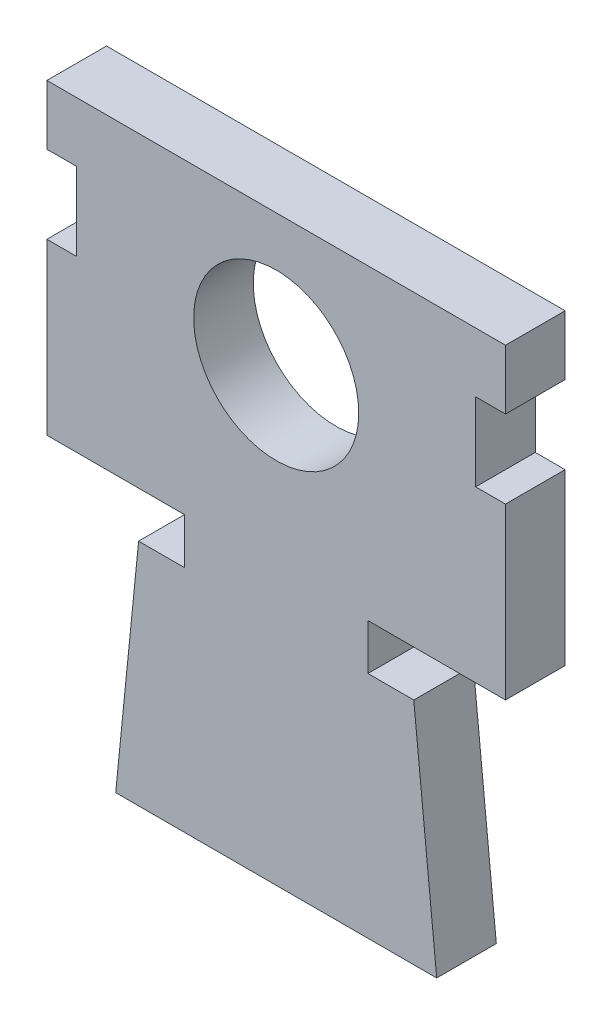
ISO-10303-21;
HEADER;
FILE_DESCRIPTION(('STEP AP214'),'2;1');
FILE_NAME('part.step','',(''),(''),'','','');
FILE_SCHEMA(('AUTOMOTIVE_DESIGN { 1 0 10303 214 1 1 1 1 }'));
ENDSEC;
DATA;
#1=APPLICATION_CONTEXT('core data for automotive mechanical design processes');
#2=APPLICATION_PROTOCOL_DEFINITION('international standard','automotive_design',2000,#1);
#3=PRODUCT_CONTEXT('',#1,'mechanical');
#4=PRODUCT('Part','Part','',(#3));
#5=PRODUCT_RELATED_PRODUCT_CATEGORY('part','',(#4));
#6=PRODUCT_DEFINITION_FORMATION('','',#4);
#7=PRODUCT_DEFINITION_CONTEXT('part definition',#1,'design');
#8=PRODUCT_DEFINITION('design','',#6,#7);
#9=PRODUCT_DEFINITION_SHAPE('','',#8);
#10=(LENGTH_UNIT() NAMED_UNIT(*) SI_UNIT(.MILLI.,.METRE.));
#11=(NAMED_UNIT(*) PLANE_ANGLE_UNIT() SI_UNIT($,.RADIAN.));
#12=(NAMED_UNIT(*) SI_UNIT($,.STERADIAN.) SOLID_ANGLE_UNIT());
#13=UNCERTAINTY_MEASURE_WITH_UNIT(LENGTH_MEASURE(1.E-05),#10,'distance_accuracy_value','');
#14=(GEOMETRIC_REPRESENTATION_CONTEXT(3) GLOBAL_UNCERTAINTY_ASSIGNED_CONTEXT((#13)) GLOBAL_UNIT_ASSIGNED_CONTEXT((#10,
#11,#12)) REPRESENTATION_CONTEXT('',''));
#15=CARTESIAN_POINT('',(0.,0.,0.));
#16=DIRECTION('',(0.,0.,1.));
#17=DIRECTION('',(1.,0.,0.));
#18=AXIS2_PLACEMENT_3D('',#15,#16,#17);
#19=CARTESIAN_POINT('',(0.,0.,1.3));
#20=DIRECTION('',(0.,0.,-1.));
#21=DIRECTION('',(-1.,0.,0.));
#22=AXIS2_PLACEMENT_3D('',#19,#20,#21);
#23=PLANE('',#22);
#24=DIRECTION('',(0.,-1.,0.));
#25=VECTOR('',#24,1.);
#26=CARTESIAN_POINT('',(-8.56550234988967,64.6174128611392,1.3));
#27=LINE('',#26,#25);
#28=CARTESIAN_POINT('',(-8.56550234988967,65.9174128611392,1.3));
#29=VERTEX_POINT('',#28);
#30=CARTESIAN_POINT('',(-8.56550234988967,64.6174128611392,1.3));
#31=VERTEX_POINT('',#30);
#32=EDGE_CURVE('E240',#29,#31,#27,.T.);
#33=ORIENTED_EDGE('',*,*,#32,.T.);
#34=DIRECTION('',(1.,0.,0.));
#35=VECTOR('',#34,1.);
#36=CARTESIAN_POINT('',(-7.91550234988968,64.6174128611392,1.3));
#37=LINE('',#36,#35);
#38=CARTESIAN_POINT('',(-7.91550234988968,64.6174128611392,1.3));
#39=VERTEX_POINT('',#38);
#40=EDGE_CURVE('E128',#31,#39,#37,.T.);
#41=ORIENTED_EDGE('',*,*,#40,.T.);
#42=DIRECTION('',(0.,-1.,0.));
#43=VECTOR('',#42,1.);
#44=CARTESIAN_POINT('',(-7.91550234988968,62.9174128611392,1.3));
#45=LINE('',#44,#43);
#46=CARTESIAN_POINT('',(-7.91550234988968,62.9174128611392,1.3));
#47=VERTEX_POINT('',#46);
#48=EDGE_CURVE('E291',#39,#47,#45,.T.);
#49=ORIENTED_EDGE('',*,*,#48,.T.);
#50=DIRECTION('',(-1.,0.,0.));
#51=VECTOR('',#50,1.);
#52=CARTESIAN_POINT('',(-8.56550234988967,62.9174128611392,1.3));
#53=LINE('',#52,#51);
#54=CARTESIAN_POINT('',(-8.56550234988967,62.9174128611392,1.3));
#55=VERTEX_POINT('',#54);
#56=EDGE_CURVE('E310',#47,#55,#53,.T.);
#57=ORIENTED_EDGE('',*,*,#56,.T.);
#58=DIRECTION('',(0.,-1.,0.));
#59=VECTOR('',#58,1.);
#60=CARTESIAN_POINT('',(-8.56550234988967,59.2174128611392,1.3));
#61=LINE('',#60,#59);
#62=CARTESIAN_POINT('',(-8.56550234988967,59.2174128611392,1.3));
#63=VERTEX_POINT('',#62);
#64=EDGE_CURVE('E307',#55,#63,#61,.T.);
#65=ORIENTED_EDGE('',*,*,#64,.T.);
#66=DIRECTION('',(1.,0.,0.));
#67=VECTOR('',#66,1.);
#68=CARTESIAN_POINT('',(-5.56550234988967,59.2174128611392,1.3));
#69=LINE('',#68,#67);
#70=CARTESIAN_POINT('',(-5.56550234988967,59.2174128611392,1.3));
#71=VERTEX_POINT('',#70);
#72=EDGE_CURVE('E309',#63,#71,#69,.T.);
#73=ORIENTED_EDGE('',*,*,#72,.T.);
#74=DIRECTION('',(0.,-1.,0.));
#75=VECTOR('',#74,1.);
#76=CARTESIAN_POINT('',(-5.56550234988967,58.2174128611392,1.3));
#77=LINE('',#76,#75);
#78=CARTESIAN_POINT('',(-5.56550234988967,58.2174128611392,1.3));
#79=VERTEX_POINT('',#78);
#80=EDGE_CURVE('E312',#71,#79,#77,.T.);
#81=ORIENTED_EDGE('',*,*,#80,.T.);
#82=DIRECTION('',(-1.,0.,0.));
#83=VECTOR('',#82,1.);
#84=CARTESIAN_POINT('',(-6.56550234988967,58.2174128611392,1.3));
#85=LINE('',#84,#83);
#86=CARTESIAN_POINT('',(-6.56550234988967,58.2174128611392,1.3));
#87=VERTEX_POINT('',#86);
#88=EDGE_CURVE('E318',#79,#87,#85,.T.);
#89=ORIENTED_EDGE('',*,*,#88,.T.);
#90=DIRECTION('',(-0.0995037190209989,-0.995037190209989,0.));
#91=VECTOR('',#90,1.);
#92=CARTESIAN_POINT('',(-7.06550234988967,53.2174128611392,1.3));
#93=LINE('',#92,#91);
#94=CARTESIAN_POINT('',(-7.06550234988967,53.2174128611392,1.3));
#95=VERTEX_POINT('',#94);
#96=EDGE_CURVE('E320',#87,#95,#93,.T.);
#97=ORIENTED_EDGE('',*,*,#96,.T.);
#98=DIRECTION('',(1.,0.,0.));
#99=VECTOR('',#98,1.);
#100=CARTESIAN_POINT('',(-0.0655023498896731,53.2174128611392,1.3));
#101=LINE('',#100,#99);
#102=CARTESIAN_POINT('',(-0.0655023498896731,53.2174128611392,1.3));
#103=VERTEX_POINT('',#102);
#104=EDGE_CURVE('E322',#95,#103,#101,.T.);
#105=ORIENTED_EDGE('',*,*,#104,.T.);
#106=DIRECTION('',(-0.0995037190209991,0.995037190209989,0.));
#107=VECTOR('',#106,1.);
#108=CARTESIAN_POINT('',(-0.565502349889674,58.2174128611392,1.3));
#109=LINE('',#108,#107);
#110=CARTESIAN_POINT('',(-0.565502349889674,58.2174128611392,1.3));
#111=VERTEX_POINT('',#110);
#112=EDGE_CURVE('E324',#103,#111,#109,.T.);
#113=ORIENTED_EDGE('',*,*,#112,.T.);
#114=DIRECTION('',(-1.,0.,0.));
#115=VECTOR('',#114,1.);
#116=CARTESIAN_POINT('',(-1.56550234988967,58.2174128611392,1.3));
#117=LINE('',#116,#115);
#118=CARTESIAN_POINT('',(-1.56550234988967,58.2174128611392,1.3));
#119=VERTEX_POINT('',#118);
#120=EDGE_CURVE('E326',#111,#119,#117,.T.);
#121=ORIENTED_EDGE('',*,*,#120,.T.);
#122=DIRECTION('',(0.,1.,0.));
#123=VECTOR('',#122,1.);
#124=CARTESIAN_POINT('',(-1.56550234988967,59.2174128611392,1.3));
#125=LINE('',#124,#123);
#126=CARTESIAN_POINT('',(-1.56550234988967,59.2174128611392,1.3));
#127=VERTEX_POINT('',#126);
#128=EDGE_CURVE('E328',#119,#127,#125,.T.);
#129=ORIENTED_EDGE('',*,*,#128,.T.);
#130=DIRECTION('',(1.,0.,0.));
#131=VECTOR('',#130,1.);
#132=CARTESIAN_POINT('',(1.43449765011033,59.2174128611392,1.3));
#133=LINE('',#132,#131);
#134=CARTESIAN_POINT('',(1.43449765011033,59.2174128611392,1.3));
#135=VERTEX_POINT('',#134);
#136=EDGE_CURVE('E330',#127,#135,#133,.T.);
#137=ORIENTED_EDGE('',*,*,#136,.T.);
#138=DIRECTION('',(0.,1.,0.));
#139=VECTOR('',#138,1.);
#140=CARTESIAN_POINT('',(1.43449765011033,62.9174128611392,1.3));
#141=LINE('',#140,#139);
#142=CARTESIAN_POINT('',(1.43449765011033,62.9174128611392,1.3));
#143=VERTEX_POINT('',#142);
#144=EDGE_CURVE('E332',#135,#143,#141,.T.);
#145=ORIENTED_EDGE('',*,*,#144,.T.);
#146=DIRECTION('',(-1.,0.,0.));
#147=VECTOR('',#146,1.);
#148=CARTESIAN_POINT('',(0.784497650110324,62.9174128611392,1.3));
#149=LINE('',#148,#147);
#150=CARTESIAN_POINT('',(0.784497650110324,62.9174128611392,1.3));
#151=VERTEX_POINT('',#150);
#152=EDGE_CURVE('E334',#143,#151,#149,.T.);
#153=ORIENTED_EDGE('',*,*,#152,.T.);
#154=DIRECTION('',(0.,1.,0.));
#155=VECTOR('',#154,1.);
#156=CARTESIAN_POINT('',(0.784497650110324,64.6174128611392,1.3));
#157=LINE('',#156,#155);
#158=CARTESIAN_POINT('',(0.784497650110324,64.6174128611392,1.3));
#159=VERTEX_POINT('',#158);
#160=EDGE_CURVE('E183',#151,#159,#157,.T.);
#161=ORIENTED_EDGE('',*,*,#160,.T.);
#162=DIRECTION('',(1.,0.,0.));
#163=VECTOR('',#162,1.);
#164=CARTESIAN_POINT('',(1.43449765011033,64.6174128611392,1.3));
#165=LINE('',#164,#163);
#166=CARTESIAN_POINT('',(1.43449765011033,64.6174128611392,1.3));
#167=VERTEX_POINT('',#166);
#168=EDGE_CURVE('E177',#159,#167,#165,.T.);
#169=ORIENTED_EDGE('',*,*,#168,.T.);
#170=DIRECTION('',(0.,1.,0.));
#171=VECTOR('',#170,1.);
#172=CARTESIAN_POINT('',(1.43449765011032,65.9174128611392,1.3));
#173=LINE('',#172,#171);
#174=CARTESIAN_POINT('',(1.43449765011032,65.9174128611392,1.3));
#175=VERTEX_POINT('',#174);
#176=EDGE_CURVE('E181',#167,#175,#173,.T.);
#177=ORIENTED_EDGE('',*,*,#176,.T.);
#178=DIRECTION('',(-1.,0.,0.));
#179=VECTOR('',#178,1.);
#180=CARTESIAN_POINT('',(-8.56550234988967,65.9174128611392,1.3));
#181=LINE('',#180,#179);
#182=EDGE_CURVE('E49',#175,#29,#181,.T.);
#183=ORIENTED_EDGE('',*,*,#182,.T.);
#184=EDGE_LOOP('',(#33,#41,#49,#57,#65,#73,#81,#89,#97,#105,#113,#121,#129,#137,#145,#153,#161,
#169,#177,#183));
#185=FACE_BOUND('',#184,.T.);
#186=CARTESIAN_POINT('',(-3.56550234988968,63.0374128611392,1.3));
#187=DIRECTION('',(0.,0.,1.));
#188=DIRECTION('',(1.,0.,0.));
#189=AXIS2_PLACEMENT_3D('',#186,#187,#188);
#190=CIRCLE('',#189,1.8);
#191=CARTESIAN_POINT('',(-1.76550234988968,63.0374128611392,1.3));
#192=VERTEX_POINT('',#191);
#193=EDGE_CURVE('E205',#192,#192,#190,.T.);
#194=ORIENTED_EDGE('',*,*,#193,.F.);
#195=EDGE_LOOP('',(#194));
#196=FACE_BOUND('',#195,.T.);
#197=ADVANCED_FACE('F32',(#185,#196),#23,.F.);
#198=CARTESIAN_POINT('',(0.,0.,0.));
#199=DIRECTION('',(0.,0.,-1.));
#200=DIRECTION('',(-1.,0.,0.));
#201=AXIS2_PLACEMENT_3D('',#198,#199,#200);
#202=PLANE('',#201);
#203=DIRECTION('',(0.,-1.,0.));
#204=VECTOR('',#203,1.);
#205=CARTESIAN_POINT('',(-8.56550234988967,64.6174128611392,0.));
#206=LINE('',#205,#204);
#207=CARTESIAN_POINT('',(-8.56550234988967,65.9174128611392,0.));
#208=VERTEX_POINT('',#207);
#209=CARTESIAN_POINT('',(-8.56550234988967,64.6174128611392,0.));
#210=VERTEX_POINT('',#209);
#211=EDGE_CURVE('E201',#208,#210,#206,.T.);
#212=ORIENTED_EDGE('',*,*,#211,.F.);
#213=DIRECTION('',(-1.,0.,0.));
#214=VECTOR('',#213,1.);
#215=CARTESIAN_POINT('',(-8.56550234988967,65.9174128611392,0.));
#216=LINE('',#215,#214);
#217=CARTESIAN_POINT('',(1.43449765011032,65.9174128611392,0.));
#218=VERTEX_POINT('',#217);
#219=EDGE_CURVE('E120',#218,#208,#216,.T.);
#220=ORIENTED_EDGE('',*,*,#219,.F.);
#221=DIRECTION('',(0.,1.,0.));
#222=VECTOR('',#221,1.);
#223=CARTESIAN_POINT('',(1.43449765011032,65.9174128611392,0.));
#224=LINE('',#223,#222);
#225=CARTESIAN_POINT('',(1.43449765011033,64.6174128611392,0.));
#226=VERTEX_POINT('',#225);
#227=EDGE_CURVE('E114',#226,#218,#224,.T.);
#228=ORIENTED_EDGE('',*,*,#227,.F.);
#229=DIRECTION('',(1.,0.,0.));
#230=VECTOR('',#229,1.);
#231=CARTESIAN_POINT('',(1.43449765011033,64.6174128611392,0.));
#232=LINE('',#231,#230);
#233=CARTESIAN_POINT('',(0.784497650110324,64.6174128611392,0.));
#234=VERTEX_POINT('',#233);
#235=EDGE_CURVE('E191',#234,#226,#232,.T.);
#236=ORIENTED_EDGE('',*,*,#235,.F.);
#237=DIRECTION('',(0.,1.,0.));
#238=VECTOR('',#237,1.);
#239=CARTESIAN_POINT('',(0.784497650110324,64.6174128611392,0.));
#240=LINE('',#239,#238);
#241=CARTESIAN_POINT('',(0.784497650110324,62.9174128611392,0.));
#242=VERTEX_POINT('',#241);
#243=EDGE_CURVE('E235',#242,#234,#240,.T.);
#244=ORIENTED_EDGE('',*,*,#243,.F.);
#245=DIRECTION('',(-1.,0.,0.));
#246=VECTOR('',#245,1.);
#247=CARTESIAN_POINT('',(0.784497650110324,62.9174128611392,0.));
#248=LINE('',#247,#246);
#249=CARTESIAN_POINT('',(1.43449765011033,62.9174128611392,0.));
#250=VERTEX_POINT('',#249);
#251=EDGE_CURVE('E233',#250,#242,#248,.T.);
#252=ORIENTED_EDGE('',*,*,#251,.F.);
#253=DIRECTION('',(0.,1.,0.));
#254=VECTOR('',#253,1.);
#255=CARTESIAN_POINT('',(1.43449765011033,62.9174128611392,0.));
#256=LINE('',#255,#254);
#257=CARTESIAN_POINT('',(1.43449765011033,59.2174128611392,0.));
#258=VERTEX_POINT('',#257);
#259=EDGE_CURVE('E231',#258,#250,#256,.T.);
#260=ORIENTED_EDGE('',*,*,#259,.F.);
#261=DIRECTION('',(1.,0.,0.));
#262=VECTOR('',#261,1.);
#263=CARTESIAN_POINT('',(1.43449765011033,59.2174128611392,0.));
#264=LINE('',#263,#262);
#265=CARTESIAN_POINT('',(-1.56550234988967,59.2174128611392,0.));
#266=VERTEX_POINT('',#265);
#267=EDGE_CURVE('E229',#266,#258,#264,.T.);
#268=ORIENTED_EDGE('',*,*,#267,.F.);
#269=DIRECTION('',(0.,1.,0.));
#270=VECTOR('',#269,1.);
#271=CARTESIAN_POINT('',(-1.56550234988967,59.2174128611392,0.));
#272=LINE('',#271,#270);
#273=CARTESIAN_POINT('',(-1.56550234988967,58.2174128611392,0.));
#274=VERTEX_POINT('',#273);
#275=EDGE_CURVE('E227',#274,#266,#272,.T.);
#276=ORIENTED_EDGE('',*,*,#275,.F.);
#277=DIRECTION('',(-1.,0.,0.));
#278=VECTOR('',#277,1.);
#279=CARTESIAN_POINT('',(-1.56550234988967,58.2174128611392,0.));
#280=LINE('',#279,#278);
#281=CARTESIAN_POINT('',(-0.565502349889674,58.2174128611392,0.));
#282=VERTEX_POINT('',#281);
#283=EDGE_CURVE('E225',#282,#274,#280,.T.);
#284=ORIENTED_EDGE('',*,*,#283,.F.);
#285=DIRECTION('',(-0.0995037190209991,0.995037190209989,0.));
#286=VECTOR('',#285,1.);
#287=CARTESIAN_POINT('',(-0.565502349889674,58.2174128611392,0.));
#288=LINE('',#287,#286);
#289=CARTESIAN_POINT('',(-0.0655023498896731,53.2174128611392,0.));
#290=VERTEX_POINT('',#289);
#291=EDGE_CURVE('E223',#290,#282,#288,.T.);
#292=ORIENTED_EDGE('',*,*,#291,.F.);
#293=DIRECTION('',(1.,0.,0.));
#294=VECTOR('',#293,1.);
#295=CARTESIAN_POINT('',(-0.0655023498896731,53.2174128611392,0.));
#296=LINE('',#295,#294);
#297=CARTESIAN_POINT('',(-7.06550234988967,53.2174128611392,0.));
#298=VERTEX_POINT('',#297);
#299=EDGE_CURVE('E221',#298,#290,#296,.T.);
#300=ORIENTED_EDGE('',*,*,#299,.F.);
#301=DIRECTION('',(-0.0995037190209989,-0.995037190209989,0.));
#302=VECTOR('',#301,1.);
#303=CARTESIAN_POINT('',(-7.06550234988967,53.2174128611392,0.));
#304=LINE('',#303,#302);
#305=CARTESIAN_POINT('',(-6.56550234988967,58.2174128611392,0.));
#306=VERTEX_POINT('',#305);
#307=EDGE_CURVE('E219',#306,#298,#304,.T.);
#308=ORIENTED_EDGE('',*,*,#307,.F.);
#309=DIRECTION('',(-1.,0.,0.));
#310=VECTOR('',#309,1.);
#311=CARTESIAN_POINT('',(-6.56550234988967,58.2174128611392,0.));
#312=LINE('',#311,#310);
#313=CARTESIAN_POINT('',(-5.56550234988967,58.2174128611392,0.));
#314=VERTEX_POINT('',#313);
#315=EDGE_CURVE('E217',#314,#306,#312,.T.);
#316=ORIENTED_EDGE('',*,*,#315,.F.);
#317=DIRECTION('',(0.,-1.,0.));
#318=VECTOR('',#317,1.);
#319=CARTESIAN_POINT('',(-5.56550234988967,58.2174128611392,0.));
#320=LINE('',#319,#318);
#321=CARTESIAN_POINT('',(-5.56550234988967,59.2174128611392,0.));
#322=VERTEX_POINT('',#321);
#323=EDGE_CURVE('E215',#322,#314,#320,.T.);
#324=ORIENTED_EDGE('',*,*,#323,.F.);
#325=DIRECTION('',(1.,0.,0.));
#326=VECTOR('',#325,1.);
#327=CARTESIAN_POINT('',(-5.56550234988967,59.2174128611392,0.));
#328=LINE('',#327,#326);
#329=CARTESIAN_POINT('',(-8.56550234988967,59.2174128611392,0.));
#330=VERTEX_POINT('',#329);
#331=EDGE_CURVE('E213',#330,#322,#328,.T.);
#332=ORIENTED_EDGE('',*,*,#331,.F.);
#333=DIRECTION('',(0.,-1.,0.));
#334=VECTOR('',#333,1.);
#335=CARTESIAN_POINT('',(-8.56550234988967,59.2174128611392,0.));
#336=LINE('',#335,#334);
#337=CARTESIAN_POINT('',(-8.56550234988967,62.9174128611392,0.));
#338=VERTEX_POINT('',#337);
#339=EDGE_CURVE('E211',#338,#330,#336,.T.);
#340=ORIENTED_EDGE('',*,*,#339,.F.);
#341=DIRECTION('',(-1.,0.,0.));
#342=VECTOR('',#341,1.);
#343=CARTESIAN_POINT('',(-8.56550234988967,62.9174128611392,0.));
#344=LINE('',#343,#342);
#345=CARTESIAN_POINT('',(-7.91550234988968,62.9174128611392,0.));
#346=VERTEX_POINT('',#345);
#347=EDGE_CURVE('E209',#346,#338,#344,.T.);
#348=ORIENTED_EDGE('',*,*,#347,.F.);
#349=DIRECTION('',(0.,-1.,0.));
#350=VECTOR('',#349,1.);
#351=CARTESIAN_POINT('',(-7.91550234988968,62.9174128611392,0.));
#352=LINE('',#351,#350);
#353=CARTESIAN_POINT('',(-7.91550234988968,64.6174128611392,0.));
#354=VERTEX_POINT('',#353);
#355=EDGE_CURVE('E207',#354,#346,#352,.T.);
#356=ORIENTED_EDGE('',*,*,#355,.F.);
#357=DIRECTION('',(1.,0.,0.));
#358=VECTOR('',#357,1.);
#359=CARTESIAN_POINT('',(-7.91550234988968,64.6174128611392,0.));
#360=LINE('',#359,#358);
#361=EDGE_CURVE('E204',#210,#354,#360,.T.);
#362=ORIENTED_EDGE('',*,*,#361,.F.);
#363=EDGE_LOOP('',(#212,#220,#228,#236,#244,#252,#260,#268,#276,#284,#292,#300,#308,#316,#324,
#332,#340,#348,#356,#362));
#364=FACE_BOUND('',#363,.T.);
#365=CARTESIAN_POINT('',(-3.56550234988968,63.0374128611392,0.));
#366=DIRECTION('',(0.,0.,1.));
#367=DIRECTION('',(1.,0.,0.));
#368=AXIS2_PLACEMENT_3D('',#365,#366,#367);
#369=CIRCLE('',#368,1.8);
#370=CARTESIAN_POINT('',(-1.76550234988968,63.0374128611392,0.));
#371=VERTEX_POINT('',#370);
#372=EDGE_CURVE('E585',#371,#371,#369,.T.);
#373=ORIENTED_EDGE('',*,*,#372,.T.);
#374=EDGE_LOOP('',(#373));
#375=FACE_BOUND('',#374,.T.);
#376=ADVANCED_FACE('F295',(#364,#375),#202,.T.);
#377=CARTESIAN_POINT('',(-8.56550234988967,64.6174128611392,1.3));
#378=DIRECTION('',(1.,0.,0.));
#379=DIRECTION('',(0.,0.,-1.));
#380=AXIS2_PLACEMENT_3D('',#377,#378,#379);
#381=PLANE('',#380);
#382=ORIENTED_EDGE('',*,*,#211,.T.);
#383=DIRECTION('',(0.,0.,-1.));
#384=VECTOR('',#383,1.);
#385=CARTESIAN_POINT('',(-8.56550234988967,64.6174128611392,1.3));
#386=LINE('',#385,#384);
#387=EDGE_CURVE('E11',#31,#210,#386,.T.);
#388=ORIENTED_EDGE('',*,*,#387,.F.);
#389=ORIENTED_EDGE('',*,*,#32,.F.);
#390=DIRECTION('',(0.,0.,-1.));
#391=VECTOR('',#390,1.);
#392=CARTESIAN_POINT('',(-8.56550234988967,65.9174128611392,1.3));
#393=LINE('',#392,#391);
#394=EDGE_CURVE('E197',#29,#208,#393,.T.);
#395=ORIENTED_EDGE('',*,*,#394,.T.);
#396=EDGE_LOOP('',(#382,#388,#389,#395));
#397=FACE_BOUND('',#396,.T.);
#398=ADVANCED_FACE('F34',(#397),#381,.F.);
#399=CARTESIAN_POINT('',(-7.91550234988968,64.6174128611392,1.3));
#400=DIRECTION('',(0.,1.,0.));
#401=DIRECTION('',(0.,0.,1.));
#402=AXIS2_PLACEMENT_3D('',#399,#400,#401);
#403=PLANE('',#402);
#404=ORIENTED_EDGE('',*,*,#361,.T.);
#405=DIRECTION('',(0.,0.,-1.));
#406=VECTOR('',#405,1.);
#407=CARTESIAN_POINT('',(-7.91550234988968,64.6174128611392,1.3));
#408=LINE('',#407,#406);
#409=EDGE_CURVE('E41',#39,#354,#408,.T.);
#410=ORIENTED_EDGE('',*,*,#409,.F.);
#411=ORIENTED_EDGE('',*,*,#40,.F.);
#412=ORIENTED_EDGE('',*,*,#387,.T.);
#413=EDGE_LOOP('',(#404,#410,#411,#412));
#414=FACE_BOUND('',#413,.T.);
#415=ADVANCED_FACE('F368',(#414),#403,.F.);
#416=CARTESIAN_POINT('',(-7.91550234988968,62.9174128611392,1.3));
#417=DIRECTION('',(1.,0.,0.));
#418=DIRECTION('',(0.,0.,-1.));
#419=AXIS2_PLACEMENT_3D('',#416,#417,#418);
#420=PLANE('',#419);
#421=ORIENTED_EDGE('',*,*,#355,.T.);
#422=DIRECTION('',(0.,0.,-1.));
#423=VECTOR('',#422,1.);
#424=CARTESIAN_POINT('',(-7.91550234988968,62.9174128611392,1.3));
#425=LINE('',#424,#423);
#426=EDGE_CURVE('E283',#47,#346,#425,.T.);
#427=ORIENTED_EDGE('',*,*,#426,.F.);
#428=ORIENTED_EDGE('',*,*,#48,.F.);
#429=ORIENTED_EDGE('',*,*,#409,.T.);
#430=EDGE_LOOP('',(#421,#427,#428,#429));
#431=FACE_BOUND('',#430,.T.);
#432=ADVANCED_FACE('F289',(#431),#420,.F.);
#433=CARTESIAN_POINT('',(-8.56550234988967,62.9174128611392,1.3));
#434=DIRECTION('',(0.,-1.,0.));
#435=DIRECTION('',(0.,0.,-1.));
#436=AXIS2_PLACEMENT_3D('',#433,#434,#435);
#437=PLANE('',#436);
#438=ORIENTED_EDGE('',*,*,#347,.T.);
#439=DIRECTION('',(0.,0.,-1.));
#440=VECTOR('',#439,1.);
#441=CARTESIAN_POINT('',(-8.56550234988967,62.9174128611392,1.3));
#442=LINE('',#441,#440);
#443=EDGE_CURVE('E280',#55,#338,#442,.T.);
#444=ORIENTED_EDGE('',*,*,#443,.F.);
#445=ORIENTED_EDGE('',*,*,#56,.F.);
#446=ORIENTED_EDGE('',*,*,#426,.T.);
#447=EDGE_LOOP('',(#438,#444,#445,#446));
#448=FACE_BOUND('',#447,.T.);
#449=ADVANCED_FACE('F301',(#448),#437,.F.);
#450=CARTESIAN_POINT('',(-8.56550234988967,59.2174128611392,1.3));
#451=DIRECTION('',(1.,0.,0.));
#452=DIRECTION('',(0.,0.,-1.));
#453=AXIS2_PLACEMENT_3D('',#450,#451,#452);
#454=PLANE('',#453);
#455=ORIENTED_EDGE('',*,*,#339,.T.);
#456=DIRECTION('',(0.,0.,-1.));
#457=VECTOR('',#456,1.);
#458=CARTESIAN_POINT('',(-8.56550234988967,59.2174128611392,1.3));
#459=LINE('',#458,#457);
#460=EDGE_CURVE('E277',#63,#330,#459,.T.);
#461=ORIENTED_EDGE('',*,*,#460,.F.);
#462=ORIENTED_EDGE('',*,*,#64,.F.);
#463=ORIENTED_EDGE('',*,*,#443,.T.);
#464=EDGE_LOOP('',(#455,#461,#462,#463));
#465=FACE_BOUND('',#464,.T.);
#466=ADVANCED_FACE('F305',(#465),#454,.F.);
#467=CARTESIAN_POINT('',(-5.56550234988967,59.2174128611392,1.3));
#468=DIRECTION('',(0.,1.,0.));
#469=DIRECTION('',(0.,0.,1.));
#470=AXIS2_PLACEMENT_3D('',#467,#468,#469);
#471=PLANE('',#470);
#472=ORIENTED_EDGE('',*,*,#331,.T.);
#473=DIRECTION('',(0.,0.,-1.));
#474=VECTOR('',#473,1.);
#475=CARTESIAN_POINT('',(-5.56550234988967,59.2174128611392,1.3));
#476=LINE('',#475,#474);
#477=EDGE_CURVE('E274',#71,#322,#476,.T.);
#478=ORIENTED_EDGE('',*,*,#477,.F.);
#479=ORIENTED_EDGE('',*,*,#72,.F.);
#480=ORIENTED_EDGE('',*,*,#460,.T.);
#481=EDGE_LOOP('',(#472,#478,#479,#480));
#482=FACE_BOUND('',#481,.T.);
#483=ADVANCED_FACE('F381',(#482),#471,.F.);
#484=CARTESIAN_POINT('',(-5.56550234988967,58.2174128611392,1.3));
#485=DIRECTION('',(1.,0.,0.));
#486=DIRECTION('',(0.,0.,-1.));
#487=AXIS2_PLACEMENT_3D('',#484,#485,#486);
#488=PLANE('',#487);
#489=ORIENTED_EDGE('',*,*,#323,.T.);
#490=DIRECTION('',(0.,0.,-1.));
#491=VECTOR('',#490,1.);
#492=CARTESIAN_POINT('',(-5.56550234988967,58.2174128611392,1.3));
#493=LINE('',#492,#491);
#494=EDGE_CURVE('E271',#79,#314,#493,.T.);
#495=ORIENTED_EDGE('',*,*,#494,.F.);
#496=ORIENTED_EDGE('',*,*,#80,.F.);
#497=ORIENTED_EDGE('',*,*,#477,.T.);
#498=EDGE_LOOP('',(#489,#495,#496,#497));
#499=FACE_BOUND('',#498,.T.);
#500=ADVANCED_FACE('F384',(#499),#488,.F.);
#501=CARTESIAN_POINT('',(-6.56550234988967,58.2174128611392,1.3));
#502=DIRECTION('',(0.,-1.,0.));
#503=DIRECTION('',(0.,0.,-1.));
#504=AXIS2_PLACEMENT_3D('',#501,#502,#503);
#505=PLANE('',#504);
#506=ORIENTED_EDGE('',*,*,#315,.T.);
#507=DIRECTION('',(0.,0.,-1.));
#508=VECTOR('',#507,1.);
#509=CARTESIAN_POINT('',(-6.56550234988967,58.2174128611392,1.3));
#510=LINE('',#509,#508);
#511=EDGE_CURVE('E268',#87,#306,#510,.T.);
#512=ORIENTED_EDGE('',*,*,#511,.F.);
#513=ORIENTED_EDGE('',*,*,#88,.F.);
#514=ORIENTED_EDGE('',*,*,#494,.T.);
#515=EDGE_LOOP('',(#506,#512,#513,#514));
#516=FACE_BOUND('',#515,.T.);
#517=ADVANCED_FACE('F388',(#516),#505,.F.);
#518=CARTESIAN_POINT('',(-7.06550234988967,53.2174128611392,1.3));
#519=DIRECTION('',(0.995037190209989,-0.0995037190209989,0.));
#520=DIRECTION('',(0.0995037190209989,0.995037190209989,0.));
#521=AXIS2_PLACEMENT_3D('',#518,#519,#520);
#522=PLANE('',#521);
#523=ORIENTED_EDGE('',*,*,#307,.T.);
#524=DIRECTION('',(0.,0.,-1.));
#525=VECTOR('',#524,1.);
#526=CARTESIAN_POINT('',(-7.06550234988967,53.2174128611392,1.3));
#527=LINE('',#526,#525);
#528=EDGE_CURVE('E265',#95,#298,#527,.T.);
#529=ORIENTED_EDGE('',*,*,#528,.F.);
#530=ORIENTED_EDGE('',*,*,#96,.F.);
#531=ORIENTED_EDGE('',*,*,#511,.T.);
#532=EDGE_LOOP('',(#523,#529,#530,#531));
#533=FACE_BOUND('',#532,.T.);
#534=ADVANCED_FACE('F392',(#533),#522,.F.);
#535=CARTESIAN_POINT('',(-0.0655023498896731,53.2174128611392,1.3));
#536=DIRECTION('',(0.,1.,0.));
#537=DIRECTION('',(0.,0.,1.));
#538=AXIS2_PLACEMENT_3D('',#535,#536,#537);
#539=PLANE('',#538);
#540=ORIENTED_EDGE('',*,*,#299,.T.);
#541=DIRECTION('',(0.,0.,-1.));
#542=VECTOR('',#541,1.);
#543=CARTESIAN_POINT('',(-0.0655023498896731,53.2174128611392,1.3));
#544=LINE('',#543,#542);
#545=EDGE_CURVE('E262',#103,#290,#544,.T.);
#546=ORIENTED_EDGE('',*,*,#545,.F.);
#547=ORIENTED_EDGE('',*,*,#104,.F.);
#548=ORIENTED_EDGE('',*,*,#528,.T.);
#549=EDGE_LOOP('',(#540,#546,#547,#548));
#550=FACE_BOUND('',#549,.T.);
#551=ADVANCED_FACE('F396',(#550),#539,.F.);
#552=CARTESIAN_POINT('',(-0.565502349889674,58.2174128611392,1.3));
#553=DIRECTION('',(-0.995037190209989,-0.0995037190209991,0.));
#554=DIRECTION('',(0.0995037190209991,-0.995037190209989,0.));
#555=AXIS2_PLACEMENT_3D('',#552,#553,#554);
#556=PLANE('',#555);
#557=ORIENTED_EDGE('',*,*,#291,.T.);
#558=DIRECTION('',(0.,0.,-1.));
#559=VECTOR('',#558,1.);
#560=CARTESIAN_POINT('',(-0.565502349889674,58.2174128611392,1.3));
#561=LINE('',#560,#559);
#562=EDGE_CURVE('E259',#111,#282,#561,.T.);
#563=ORIENTED_EDGE('',*,*,#562,.F.);
#564=ORIENTED_EDGE('',*,*,#112,.F.);
#565=ORIENTED_EDGE('',*,*,#545,.T.);
#566=EDGE_LOOP('',(#557,#563,#564,#565));
#567=FACE_BOUND('',#566,.T.);
#568=ADVANCED_FACE('F400',(#567),#556,.F.);
#569=CARTESIAN_POINT('',(-1.56550234988967,58.2174128611392,1.3));
#570=DIRECTION('',(0.,-1.,0.));
#571=DIRECTION('',(0.,0.,-1.));
#572=AXIS2_PLACEMENT_3D('',#569,#570,#571);
#573=PLANE('',#572);
#574=ORIENTED_EDGE('',*,*,#283,.T.);
#575=DIRECTION('',(0.,0.,-1.));
#576=VECTOR('',#575,1.);
#577=CARTESIAN_POINT('',(-1.56550234988967,58.2174128611392,1.3));
#578=LINE('',#577,#576);
#579=EDGE_CURVE('E256',#119,#274,#578,.T.);
#580=ORIENTED_EDGE('',*,*,#579,.F.);
#581=ORIENTED_EDGE('',*,*,#120,.F.);
#582=ORIENTED_EDGE('',*,*,#562,.T.);
#583=EDGE_LOOP('',(#574,#580,#581,#582));
#584=FACE_BOUND('',#583,.T.);
#585=ADVANCED_FACE('F404',(#584),#573,.F.);
#586=CARTESIAN_POINT('',(-1.56550234988967,59.2174128611392,1.3));
#587=DIRECTION('',(-1.,0.,0.));
#588=DIRECTION('',(0.,-1.,0.));
#589=AXIS2_PLACEMENT_3D('',#586,#587,#588);
#590=PLANE('',#589);
#591=ORIENTED_EDGE('',*,*,#275,.T.);
#592=DIRECTION('',(0.,0.,-1.));
#593=VECTOR('',#592,1.);
#594=CARTESIAN_POINT('',(-1.56550234988967,59.2174128611392,1.3));
#595=LINE('',#594,#593);
#596=EDGE_CURVE('E253',#127,#266,#595,.T.);
#597=ORIENTED_EDGE('',*,*,#596,.F.);
#598=ORIENTED_EDGE('',*,*,#128,.F.);
#599=ORIENTED_EDGE('',*,*,#579,.T.);
#600=EDGE_LOOP('',(#591,#597,#598,#599));
#601=FACE_BOUND('',#600,.T.);
#602=ADVANCED_FACE('F408',(#601),#590,.F.);
#603=CARTESIAN_POINT('',(1.43449765011033,59.2174128611392,1.3));
#604=DIRECTION('',(0.,1.,0.));
#605=DIRECTION('',(0.,0.,1.));
#606=AXIS2_PLACEMENT_3D('',#603,#604,#605);
#607=PLANE('',#606);
#608=ORIENTED_EDGE('',*,*,#267,.T.);
#609=DIRECTION('',(0.,0.,-1.));
#610=VECTOR('',#609,1.);
#611=CARTESIAN_POINT('',(1.43449765011033,59.2174128611392,1.3));
#612=LINE('',#611,#610);
#613=EDGE_CURVE('E250',#135,#258,#612,.T.);
#614=ORIENTED_EDGE('',*,*,#613,.F.);
#615=ORIENTED_EDGE('',*,*,#136,.F.);
#616=ORIENTED_EDGE('',*,*,#596,.T.);
#617=EDGE_LOOP('',(#608,#614,#615,#616));
#618=FACE_BOUND('',#617,.T.);
#619=ADVANCED_FACE('F412',(#618),#607,.F.);
#620=CARTESIAN_POINT('',(1.43449765011033,62.9174128611392,1.3));
#621=DIRECTION('',(-1.,0.,0.));
#622=DIRECTION('',(0.,-1.,0.));
#623=AXIS2_PLACEMENT_3D('',#620,#621,#622);
#624=PLANE('',#623);
#625=ORIENTED_EDGE('',*,*,#259,.T.);
#626=DIRECTION('',(0.,0.,-1.));
#627=VECTOR('',#626,1.);
#628=CARTESIAN_POINT('',(1.43449765011033,62.9174128611392,1.3));
#629=LINE('',#628,#627);
#630=EDGE_CURVE('E247',#143,#250,#629,.T.);
#631=ORIENTED_EDGE('',*,*,#630,.F.);
#632=ORIENTED_EDGE('',*,*,#144,.F.);
#633=ORIENTED_EDGE('',*,*,#613,.T.);
#634=EDGE_LOOP('',(#625,#631,#632,#633));
#635=FACE_BOUND('',#634,.T.);
#636=ADVANCED_FACE('F416',(#635),#624,.F.);
#637=CARTESIAN_POINT('',(0.784497650110324,62.9174128611392,1.3));
#638=DIRECTION('',(0.,-1.,0.));
#639=DIRECTION('',(0.,0.,-1.));
#640=AXIS2_PLACEMENT_3D('',#637,#638,#639);
#641=PLANE('',#640);
#642=ORIENTED_EDGE('',*,*,#251,.T.);
#643=DIRECTION('',(0.,0.,-1.));
#644=VECTOR('',#643,1.);
#645=CARTESIAN_POINT('',(0.784497650110324,62.9174128611392,1.3));
#646=LINE('',#645,#644);
#647=EDGE_CURVE('E244',#151,#242,#646,.T.);
#648=ORIENTED_EDGE('',*,*,#647,.F.);
#649=ORIENTED_EDGE('',*,*,#152,.F.);
#650=ORIENTED_EDGE('',*,*,#630,.T.);
#651=EDGE_LOOP('',(#642,#648,#649,#650));
#652=FACE_BOUND('',#651,.T.);
#653=ADVANCED_FACE('F340',(#652),#641,.F.);
#654=CARTESIAN_POINT('',(0.784497650110324,64.6174128611392,1.3));
#655=DIRECTION('',(-1.,0.,0.));
#656=DIRECTION('',(0.,-1.,0.));
#657=AXIS2_PLACEMENT_3D('',#654,#655,#656);
#658=PLANE('',#657);
#659=ORIENTED_EDGE('',*,*,#243,.T.);
#660=DIRECTION('',(0.,0.,-1.));
#661=VECTOR('',#660,1.);
#662=CARTESIAN_POINT('',(0.784497650110324,64.6174128611392,1.3));
#663=LINE('',#662,#661);
#664=EDGE_CURVE('E192',#159,#234,#663,.T.);
#665=ORIENTED_EDGE('',*,*,#664,.F.);
#666=ORIENTED_EDGE('',*,*,#160,.F.);
#667=ORIENTED_EDGE('',*,*,#647,.T.);
#668=EDGE_LOOP('',(#659,#665,#666,#667));
#669=FACE_BOUND('',#668,.T.);
#670=ADVANCED_FACE('F344',(#669),#658,.F.);
#671=CARTESIAN_POINT('',(1.43449765011033,64.6174128611392,1.3));
#672=DIRECTION('',(0.,1.,0.));
#673=DIRECTION('',(0.,0.,1.));
#674=AXIS2_PLACEMENT_3D('',#671,#672,#673);
#675=PLANE('',#674);
#676=ORIENTED_EDGE('',*,*,#235,.T.);
#677=DIRECTION('',(0.,0.,-1.));
#678=VECTOR('',#677,1.);
#679=CARTESIAN_POINT('',(1.43449765011033,64.6174128611392,1.3));
#680=LINE('',#679,#678);
#681=EDGE_CURVE('E188',#167,#226,#680,.T.);
#682=ORIENTED_EDGE('',*,*,#681,.F.);
#683=ORIENTED_EDGE('',*,*,#168,.F.);
#684=ORIENTED_EDGE('',*,*,#664,.T.);
#685=EDGE_LOOP('',(#676,#682,#683,#684));
#686=FACE_BOUND('',#685,.T.);
#687=ADVANCED_FACE('F189',(#686),#675,.F.);
#688=CARTESIAN_POINT('',(1.43449765011032,65.9174128611392,1.3));
#689=DIRECTION('',(-1.,0.,0.));
#690=DIRECTION('',(0.,-1.,0.));
#691=AXIS2_PLACEMENT_3D('',#688,#689,#690);
#692=PLANE('',#691);
#693=ORIENTED_EDGE('',*,*,#227,.T.);
#694=DIRECTION('',(0.,0.,-1.));
#695=VECTOR('',#694,1.);
#696=CARTESIAN_POINT('',(1.43449765011032,65.9174128611392,1.3));
#697=LINE('',#696,#695);
#698=EDGE_CURVE('E193',#175,#218,#697,.T.);
#699=ORIENTED_EDGE('',*,*,#698,.F.);
#700=ORIENTED_EDGE('',*,*,#176,.F.);
#701=ORIENTED_EDGE('',*,*,#681,.T.);
#702=EDGE_LOOP('',(#693,#699,#700,#701));
#703=FACE_BOUND('',#702,.T.);
#704=ADVANCED_FACE('F195',(#703),#692,.F.);
#705=CARTESIAN_POINT('',(-8.56550234988967,65.9174128611392,1.3));
#706=DIRECTION('',(0.,-1.,0.));
#707=DIRECTION('',(0.,0.,-1.));
#708=AXIS2_PLACEMENT_3D('',#705,#706,#707);
#709=PLANE('',#708);
#710=ORIENTED_EDGE('',*,*,#219,.T.);
#711=ORIENTED_EDGE('',*,*,#394,.F.);
#712=ORIENTED_EDGE('',*,*,#182,.F.);
#713=ORIENTED_EDGE('',*,*,#698,.T.);
#714=EDGE_LOOP('',(#710,#711,#712,#713));
#715=FACE_BOUND('',#714,.T.);
#716=ADVANCED_FACE('F348',(#715),#709,.F.);
#717=CARTESIAN_POINT('',(-3.56550234988968,63.0374128611392,1.3));
#718=DIRECTION('',(0.,0.,-1.));
#719=DIRECTION('',(-1.,0.,0.));
#720=AXIS2_PLACEMENT_3D('',#717,#718,#719);
#721=CYLINDRICAL_SURFACE('',#720,1.8);
#722=ORIENTED_EDGE('',*,*,#193,.T.);
#723=EDGE_LOOP('',(#722));
#724=FACE_BOUND('',#723,.T.);
#725=ORIENTED_EDGE('',*,*,#372,.F.);
#726=EDGE_LOOP('',(#725));
#727=FACE_BOUND('',#726,.T.);
#728=ADVANCED_FACE('F350',(#724,#727),#721,.F.);
#729=CLOSED_SHELL('',(#197,#376,#398,#415,#432,#449,#466,#483,#500,#517,#534,#551,#568,#585,
#602,#619,#636,#653,#670,#687,#704,#716,#728));
#730=MANIFOLD_SOLID_BREP('B2',#729);
#731=ADVANCED_BREP_SHAPE_REPRESENTATION('',(#18,#730),#14);
#732=SHAPE_DEFINITION_REPRESENTATION(#9,#731);
ENDSEC;
END-ISO-10303-21;
